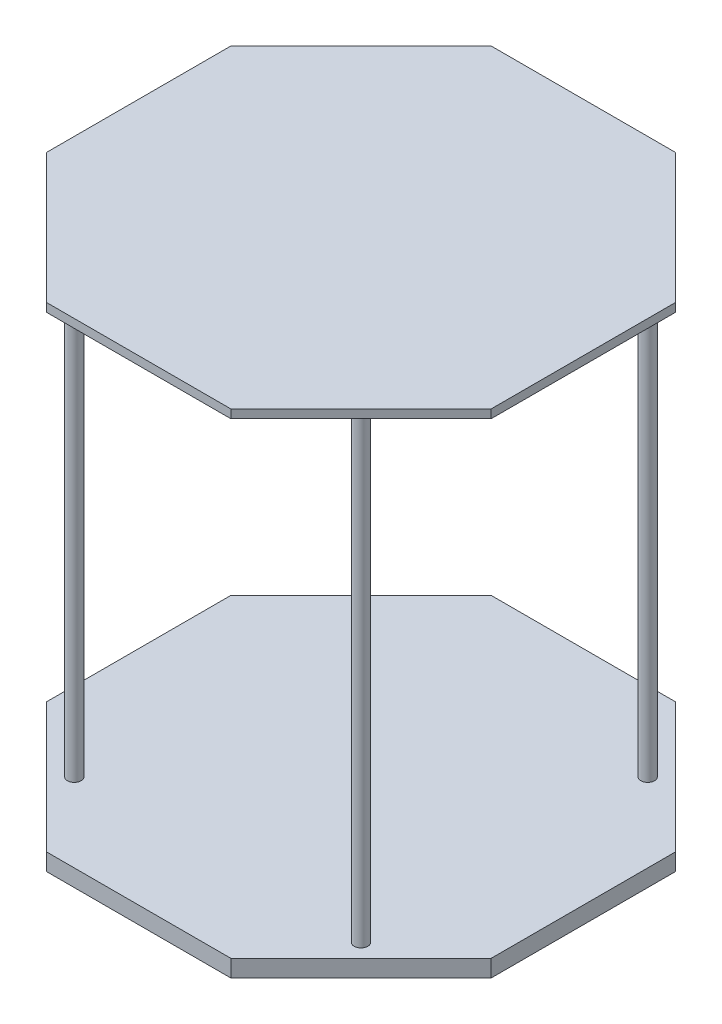
ISO-10303-21;
HEADER;
FILE_DESCRIPTION(('STEP AP214'),'2;1');
FILE_NAME('part.step','',(''),(''),'','','');
FILE_SCHEMA(('AUTOMOTIVE_DESIGN { 1 0 10303 214 1 1 1 1 }'));
ENDSEC;
DATA;
#1=APPLICATION_CONTEXT('core data for automotive mechanical design processes');
#2=APPLICATION_PROTOCOL_DEFINITION('international standard','automotive_design',2000,#1);
#3=PRODUCT_CONTEXT('',#1,'mechanical');
#4=PRODUCT('Part','Part','',(#3));
#5=PRODUCT_RELATED_PRODUCT_CATEGORY('part','',(#4));
#6=PRODUCT_DEFINITION_FORMATION('','',#4);
#7=PRODUCT_DEFINITION_CONTEXT('part definition',#1,'design');
#8=PRODUCT_DEFINITION('design','',#6,#7);
#9=PRODUCT_DEFINITION_SHAPE('','',#8);
#10=(LENGTH_UNIT() NAMED_UNIT(*) SI_UNIT(.MILLI.,.METRE.));
#11=(NAMED_UNIT(*) PLANE_ANGLE_UNIT() SI_UNIT($,.RADIAN.));
#12=(NAMED_UNIT(*) SI_UNIT($,.STERADIAN.) SOLID_ANGLE_UNIT());
#13=UNCERTAINTY_MEASURE_WITH_UNIT(LENGTH_MEASURE(1.E-05),#10,'distance_accuracy_value','');
#14=(GEOMETRIC_REPRESENTATION_CONTEXT(3) GLOBAL_UNCERTAINTY_ASSIGNED_CONTEXT((#13)) GLOBAL_UNIT_ASSIGNED_CONTEXT((#10,
#11,#12)) REPRESENTATION_CONTEXT('',''));
#15=CARTESIAN_POINT('',(0.,0.,0.));
#16=DIRECTION('',(0.,0.,1.));
#17=DIRECTION('',(1.,0.,0.));
#18=AXIS2_PLACEMENT_3D('',#15,#16,#17);
#19=CARTESIAN_POINT('',(82.6843541332094,6.35,34.2489808780352));
#20=DIRECTION('',(-1.,0.,0.));
#21=DIRECTION('',(0.,0.,1.));
#22=AXIS2_PLACEMENT_3D('',#19,#20,#21);
#23=PLANE('',#22);
#24=DIRECTION('',(0.,0.,-1.));
#25=VECTOR('',#24,1.);
#26=CARTESIAN_POINT('',(82.6843541332094,0.,34.2489808780352));
#27=LINE('',#26,#25);
#28=CARTESIAN_POINT('',(82.6843541332094,0.,34.2489808780352));
#29=VERTEX_POINT('',#28);
#30=CARTESIAN_POINT('',(82.6843541332094,0.,-34.2489808780352));
#31=VERTEX_POINT('',#30);
#32=EDGE_CURVE('E138',#29,#31,#27,.T.);
#33=ORIENTED_EDGE('',*,*,#32,.T.);
#34=DIRECTION('',(0.,-1.,0.));
#35=VECTOR('',#34,1.);
#36=CARTESIAN_POINT('',(82.6843541332094,6.35,-34.2489808780352));
#37=LINE('',#36,#35);
#38=CARTESIAN_POINT('',(82.6843541332094,6.35,-34.2489808780352));
#39=VERTEX_POINT('',#38);
#40=EDGE_CURVE('E11',#39,#31,#37,.T.);
#41=ORIENTED_EDGE('',*,*,#40,.F.);
#42=DIRECTION('',(0.,0.,-1.));
#43=VECTOR('',#42,1.);
#44=CARTESIAN_POINT('',(82.6843541332094,6.35,34.2489808780352));
#45=LINE('',#44,#43);
#46=CARTESIAN_POINT('',(82.6843541332094,6.35,34.2489808780352));
#47=VERTEX_POINT('',#46);
#48=EDGE_CURVE('E153',#47,#39,#45,.T.);
#49=ORIENTED_EDGE('',*,*,#48,.F.);
#50=DIRECTION('',(0.,-1.,0.));
#51=VECTOR('',#50,1.);
#52=CARTESIAN_POINT('',(82.6843541332094,6.35,34.2489808780352));
#53=LINE('',#52,#51);
#54=EDGE_CURVE('E134',#47,#29,#53,.T.);
#55=ORIENTED_EDGE('',*,*,#54,.T.);
#56=EDGE_LOOP('',(#33,#41,#49,#55));
#57=FACE_BOUND('',#56,.T.);
#58=ADVANCED_FACE('F38',(#57),#23,.F.);
#59=CARTESIAN_POINT('',(82.6843541332094,6.35,-34.2489808780352));
#60=DIRECTION('',(-0.707106781186547,0.,0.707106781186548));
#61=DIRECTION('',(0.707106781186548,0.,0.707106781186547));
#62=AXIS2_PLACEMENT_3D('',#59,#60,#61);
#63=PLANE('',#62);
#64=DIRECTION('',(-0.707106781186548,0.,-0.707106781186547));
#65=VECTOR('',#64,1.);
#66=CARTESIAN_POINT('',(82.6843541332094,0.,-34.2489808780352));
#67=LINE('',#66,#65);
#68=CARTESIAN_POINT('',(34.2489808780352,0.,-82.6843541332094));
#69=VERTEX_POINT('',#68);
#70=EDGE_CURVE('E141',#31,#69,#67,.T.);
#71=ORIENTED_EDGE('',*,*,#70,.T.);
#72=DIRECTION('',(0.,-1.,0.));
#73=VECTOR('',#72,1.);
#74=CARTESIAN_POINT('',(34.2489808780352,6.35,-82.6843541332094));
#75=LINE('',#74,#73);
#76=CARTESIAN_POINT('',(34.2489808780352,6.35,-82.6843541332094));
#77=VERTEX_POINT('',#76);
#78=EDGE_CURVE('E46',#77,#69,#75,.T.);
#79=ORIENTED_EDGE('',*,*,#78,.F.);
#80=DIRECTION('',(-0.707106781186548,0.,-0.707106781186547));
#81=VECTOR('',#80,1.);
#82=CARTESIAN_POINT('',(82.6843541332094,6.35,-34.2489808780352));
#83=LINE('',#82,#81);
#84=EDGE_CURVE('E98',#39,#77,#83,.T.);
#85=ORIENTED_EDGE('',*,*,#84,.F.);
#86=ORIENTED_EDGE('',*,*,#40,.T.);
#87=EDGE_LOOP('',(#71,#79,#85,#86));
#88=FACE_BOUND('',#87,.T.);
#89=ADVANCED_FACE('F331',(#88),#63,.F.);
#90=CARTESIAN_POINT('',(34.2489808780352,6.35,-82.6843541332094));
#91=DIRECTION('',(0.,0.,1.));
#92=DIRECTION('',(1.,0.,0.));
#93=AXIS2_PLACEMENT_3D('',#90,#91,#92);
#94=PLANE('',#93);
#95=DIRECTION('',(-1.,0.,0.));
#96=VECTOR('',#95,1.);
#97=CARTESIAN_POINT('',(34.2489808780352,0.,-82.6843541332094));
#98=LINE('',#97,#96);
#99=CARTESIAN_POINT('',(-34.2489808780352,0.,-82.6843541332094));
#100=VERTEX_POINT('',#99);
#101=EDGE_CURVE('E144',#69,#100,#98,.T.);
#102=ORIENTED_EDGE('',*,*,#101,.T.);
#103=DIRECTION('',(0.,-1.,0.));
#104=VECTOR('',#103,1.);
#105=CARTESIAN_POINT('',(-34.2489808780352,6.35,-82.6843541332094));
#106=LINE('',#105,#104);
#107=CARTESIAN_POINT('',(-34.2489808780352,6.35,-82.6843541332094));
#108=VERTEX_POINT('',#107);
#109=EDGE_CURVE('E160',#108,#100,#106,.T.);
#110=ORIENTED_EDGE('',*,*,#109,.F.);
#111=DIRECTION('',(-1.,0.,0.));
#112=VECTOR('',#111,1.);
#113=CARTESIAN_POINT('',(34.2489808780352,6.35,-82.6843541332094));
#114=LINE('',#113,#112);
#115=EDGE_CURVE('E168',#77,#108,#114,.T.);
#116=ORIENTED_EDGE('',*,*,#115,.F.);
#117=ORIENTED_EDGE('',*,*,#78,.T.);
#118=EDGE_LOOP('',(#102,#110,#116,#117));
#119=FACE_BOUND('',#118,.T.);
#120=ADVANCED_FACE('F166',(#119),#94,.F.);
#121=CARTESIAN_POINT('',(-34.2489808780352,6.35,-82.6843541332094));
#122=DIRECTION('',(0.707106781186548,0.,0.707106781186547));
#123=DIRECTION('',(0.707106781186547,0.,-0.707106781186548));
#124=AXIS2_PLACEMENT_3D('',#121,#122,#123);
#125=PLANE('',#124);
#126=DIRECTION('',(-0.707106781186547,0.,0.707106781186548));
#127=VECTOR('',#126,1.);
#128=CARTESIAN_POINT('',(-34.2489808780352,0.,-82.6843541332094));
#129=LINE('',#128,#127);
#130=CARTESIAN_POINT('',(-82.6843541332094,0.,-34.2489808780351));
#131=VERTEX_POINT('',#130);
#132=EDGE_CURVE('E146',#100,#131,#129,.T.);
#133=ORIENTED_EDGE('',*,*,#132,.T.);
#134=DIRECTION('',(0.,-1.,0.));
#135=VECTOR('',#134,1.);
#136=CARTESIAN_POINT('',(-82.6843541332094,6.35,-34.2489808780351));
#137=LINE('',#136,#135);
#138=CARTESIAN_POINT('',(-82.6843541332094,6.35,-34.2489808780351));
#139=VERTEX_POINT('',#138);
#140=EDGE_CURVE('E157',#139,#131,#137,.T.);
#141=ORIENTED_EDGE('',*,*,#140,.F.);
#142=DIRECTION('',(-0.707106781186547,0.,0.707106781186548));
#143=VECTOR('',#142,1.);
#144=CARTESIAN_POINT('',(-34.2489808780352,6.35,-82.6843541332094));
#145=LINE('',#144,#143);
#146=EDGE_CURVE('E180',#108,#139,#145,.T.);
#147=ORIENTED_EDGE('',*,*,#146,.F.);
#148=ORIENTED_EDGE('',*,*,#109,.T.);
#149=EDGE_LOOP('',(#133,#141,#147,#148));
#150=FACE_BOUND('',#149,.T.);
#151=ADVANCED_FACE('F176',(#150),#125,.F.);
#152=CARTESIAN_POINT('',(-82.6843541332094,6.35,-34.2489808780351));
#153=DIRECTION('',(1.,0.,0.));
#154=DIRECTION('',(0.,0.,-1.));
#155=AXIS2_PLACEMENT_3D('',#152,#153,#154);
#156=PLANE('',#155);
#157=DIRECTION('',(0.,0.,1.));
#158=VECTOR('',#157,1.);
#159=CARTESIAN_POINT('',(-82.6843541332094,0.,-34.2489808780351));
#160=LINE('',#159,#158);
#161=CARTESIAN_POINT('',(-82.6843541332094,0.,34.2489808780352));
#162=VERTEX_POINT('',#161);
#163=EDGE_CURVE('E148',#131,#162,#160,.T.);
#164=ORIENTED_EDGE('',*,*,#163,.T.);
#165=DIRECTION('',(0.,-1.,0.));
#166=VECTOR('',#165,1.);
#167=CARTESIAN_POINT('',(-82.6843541332094,6.35,34.2489808780352));
#168=LINE('',#167,#166);
#169=CARTESIAN_POINT('',(-82.6843541332094,6.35,34.2489808780352));
#170=VERTEX_POINT('',#169);
#171=EDGE_CURVE('E129',#170,#162,#168,.T.);
#172=ORIENTED_EDGE('',*,*,#171,.F.);
#173=DIRECTION('',(0.,0.,1.));
#174=VECTOR('',#173,1.);
#175=CARTESIAN_POINT('',(-82.6843541332094,6.35,-34.2489808780351));
#176=LINE('',#175,#174);
#177=EDGE_CURVE('E120',#139,#170,#176,.T.);
#178=ORIENTED_EDGE('',*,*,#177,.F.);
#179=ORIENTED_EDGE('',*,*,#140,.T.);
#180=EDGE_LOOP('',(#164,#172,#178,#179));
#181=FACE_BOUND('',#180,.T.);
#182=ADVANCED_FACE('F179',(#181),#156,.F.);
#183=CARTESIAN_POINT('',(-82.6843541332094,6.35,34.2489808780352));
#184=DIRECTION('',(0.707106781186548,0.,-0.707106781186547));
#185=DIRECTION('',(-0.707106781186547,0.,-0.707106781186548));
#186=AXIS2_PLACEMENT_3D('',#183,#184,#185);
#187=PLANE('',#186);
#188=DIRECTION('',(0.707106781186547,0.,0.707106781186548));
#189=VECTOR('',#188,1.);
#190=CARTESIAN_POINT('',(-82.6843541332094,0.,34.2489808780352));
#191=LINE('',#190,#189);
#192=CARTESIAN_POINT('',(-34.2489808780352,0.,82.6843541332094));
#193=VERTEX_POINT('',#192);
#194=EDGE_CURVE('E128',#162,#193,#191,.T.);
#195=ORIENTED_EDGE('',*,*,#194,.T.);
#196=DIRECTION('',(0.,-1.,0.));
#197=VECTOR('',#196,1.);
#198=CARTESIAN_POINT('',(-34.2489808780352,6.35,82.6843541332094));
#199=LINE('',#198,#197);
#200=CARTESIAN_POINT('',(-34.2489808780352,6.35,82.6843541332094));
#201=VERTEX_POINT('',#200);
#202=EDGE_CURVE('E125',#201,#193,#199,.T.);
#203=ORIENTED_EDGE('',*,*,#202,.F.);
#204=DIRECTION('',(0.707106781186547,0.,0.707106781186548));
#205=VECTOR('',#204,1.);
#206=CARTESIAN_POINT('',(-82.6843541332094,6.35,34.2489808780352));
#207=LINE('',#206,#205);
#208=EDGE_CURVE('E114',#170,#201,#207,.T.);
#209=ORIENTED_EDGE('',*,*,#208,.F.);
#210=ORIENTED_EDGE('',*,*,#171,.T.);
#211=EDGE_LOOP('',(#195,#203,#209,#210));
#212=FACE_BOUND('',#211,.T.);
#213=ADVANCED_FACE('F126',(#212),#187,.F.);
#214=CARTESIAN_POINT('',(-34.2489808780352,6.35,82.6843541332094));
#215=DIRECTION('',(0.,0.,-1.));
#216=DIRECTION('',(-1.,0.,0.));
#217=AXIS2_PLACEMENT_3D('',#214,#215,#216);
#218=PLANE('',#217);
#219=DIRECTION('',(1.,0.,0.));
#220=VECTOR('',#219,1.);
#221=CARTESIAN_POINT('',(-34.2489808780352,0.,82.6843541332094));
#222=LINE('',#221,#220);
#223=CARTESIAN_POINT('',(34.2489808780352,0.,82.6843541332094));
#224=VERTEX_POINT('',#223);
#225=EDGE_CURVE('E84',#193,#224,#222,.T.);
#226=ORIENTED_EDGE('',*,*,#225,.T.);
#227=DIRECTION('',(0.,-1.,0.));
#228=VECTOR('',#227,1.);
#229=CARTESIAN_POINT('',(34.2489808780352,6.35,82.6843541332094));
#230=LINE('',#229,#228);
#231=CARTESIAN_POINT('',(34.2489808780352,6.35,82.6843541332094));
#232=VERTEX_POINT('',#231);
#233=EDGE_CURVE('E130',#232,#224,#230,.T.);
#234=ORIENTED_EDGE('',*,*,#233,.F.);
#235=DIRECTION('',(1.,0.,0.));
#236=VECTOR('',#235,1.);
#237=CARTESIAN_POINT('',(-34.2489808780352,6.35,82.6843541332094));
#238=LINE('',#237,#236);
#239=EDGE_CURVE('E118',#201,#232,#238,.T.);
#240=ORIENTED_EDGE('',*,*,#239,.F.);
#241=ORIENTED_EDGE('',*,*,#202,.T.);
#242=EDGE_LOOP('',(#226,#234,#240,#241));
#243=FACE_BOUND('',#242,.T.);
#244=ADVANCED_FACE('F132',(#243),#218,.F.);
#245=CARTESIAN_POINT('',(34.2489808780352,6.35,82.6843541332094));
#246=DIRECTION('',(-0.707106781186547,0.,-0.707106781186548));
#247=DIRECTION('',(-0.707106781186548,0.,0.707106781186547));
#248=AXIS2_PLACEMENT_3D('',#245,#246,#247);
#249=PLANE('',#248);
#250=DIRECTION('',(0.707106781186548,0.,-0.707106781186547));
#251=VECTOR('',#250,1.);
#252=CARTESIAN_POINT('',(34.2489808780352,0.,82.6843541332094));
#253=LINE('',#252,#251);
#254=EDGE_CURVE('E90',#224,#29,#253,.T.);
#255=ORIENTED_EDGE('',*,*,#254,.T.);
#256=ORIENTED_EDGE('',*,*,#54,.F.);
#257=DIRECTION('',(0.707106781186548,0.,-0.707106781186547));
#258=VECTOR('',#257,1.);
#259=CARTESIAN_POINT('',(34.2489808780352,6.35,82.6843541332094));
#260=LINE('',#259,#258);
#261=EDGE_CURVE('E54',#232,#47,#260,.T.);
#262=ORIENTED_EDGE('',*,*,#261,.F.);
#263=ORIENTED_EDGE('',*,*,#233,.T.);
#264=EDGE_LOOP('',(#255,#256,#262,#263));
#265=FACE_BOUND('',#264,.T.);
#266=ADVANCED_FACE('F338',(#265),#249,.F.);
#267=CARTESIAN_POINT('',(0.,6.35,0.));
#268=DIRECTION('',(0.,1.,0.));
#269=DIRECTION('',(0.,0.,1.));
#270=AXIS2_PLACEMENT_3D('',#267,#268,#269);
#271=PLANE('',#270);
#272=CARTESIAN_POINT('',(-53.34,6.35,53.34));
#273=DIRECTION('',(0.,1.,0.));
#274=DIRECTION('',(0.,0.,1.));
#275=AXIS2_PLACEMENT_3D('',#272,#273,#274);
#276=CIRCLE('',#275,2.54);
#277=CARTESIAN_POINT('',(-53.34,6.35,55.88));
#278=VERTEX_POINT('',#277);
#279=EDGE_CURVE('E204',#278,#278,#276,.T.);
#280=ORIENTED_EDGE('',*,*,#279,.F.);
#281=EDGE_LOOP('',(#280));
#282=FACE_BOUND('',#281,.T.);
#283=CARTESIAN_POINT('',(53.34,6.35,53.34));
#284=DIRECTION('',(0.,1.,0.));
#285=DIRECTION('',(0.,0.,-1.));
#286=AXIS2_PLACEMENT_3D('',#283,#284,#285);
#287=CIRCLE('',#286,2.54);
#288=CARTESIAN_POINT('',(53.34,6.35,50.8));
#289=VERTEX_POINT('',#288);
#290=EDGE_CURVE('E198',#289,#289,#287,.T.);
#291=ORIENTED_EDGE('',*,*,#290,.F.);
#292=EDGE_LOOP('',(#291));
#293=FACE_BOUND('',#292,.T.);
#294=CARTESIAN_POINT('',(-53.34,6.35,-53.34));
#295=DIRECTION('',(0.,1.,0.));
#296=DIRECTION('',(0.,0.,-1.));
#297=AXIS2_PLACEMENT_3D('',#294,#295,#296);
#298=CIRCLE('',#297,2.54);
#299=CARTESIAN_POINT('',(-53.34,6.35,-55.88));
#300=VERTEX_POINT('',#299);
#301=EDGE_CURVE('E192',#300,#300,#298,.T.);
#302=ORIENTED_EDGE('',*,*,#301,.F.);
#303=EDGE_LOOP('',(#302));
#304=FACE_BOUND('',#303,.T.);
#305=CARTESIAN_POINT('',(53.34,6.35,-53.34));
#306=DIRECTION('',(0.,1.,0.));
#307=DIRECTION('',(0.,0.,1.));
#308=AXIS2_PLACEMENT_3D('',#305,#306,#307);
#309=CIRCLE('',#308,2.54);
#310=CARTESIAN_POINT('',(53.34,6.35,-50.8));
#311=VERTEX_POINT('',#310);
#312=EDGE_CURVE('E186',#311,#311,#309,.T.);
#313=ORIENTED_EDGE('',*,*,#312,.F.);
#314=EDGE_LOOP('',(#313));
#315=FACE_BOUND('',#314,.T.);
#316=ORIENTED_EDGE('',*,*,#48,.T.);
#317=ORIENTED_EDGE('',*,*,#84,.T.);
#318=ORIENTED_EDGE('',*,*,#115,.T.);
#319=ORIENTED_EDGE('',*,*,#146,.T.);
#320=ORIENTED_EDGE('',*,*,#177,.T.);
#321=ORIENTED_EDGE('',*,*,#208,.T.);
#322=ORIENTED_EDGE('',*,*,#239,.T.);
#323=ORIENTED_EDGE('',*,*,#261,.T.);
#324=EDGE_LOOP('',(#316,#317,#318,#319,#320,#321,#322,#323));
#325=FACE_BOUND('',#324,.T.);
#326=ADVANCED_FACE('F116',(#282,#293,#304,#315,#325),#271,.T.);
#327=CARTESIAN_POINT('',(0.,0.,0.));
#328=DIRECTION('',(0.,1.,0.));
#329=DIRECTION('',(0.,0.,1.));
#330=AXIS2_PLACEMENT_3D('',#327,#328,#329);
#331=PLANE('',#330);
#332=ORIENTED_EDGE('',*,*,#32,.F.);
#333=ORIENTED_EDGE('',*,*,#254,.F.);
#334=ORIENTED_EDGE('',*,*,#225,.F.);
#335=ORIENTED_EDGE('',*,*,#194,.F.);
#336=ORIENTED_EDGE('',*,*,#163,.F.);
#337=ORIENTED_EDGE('',*,*,#132,.F.);
#338=ORIENTED_EDGE('',*,*,#101,.F.);
#339=ORIENTED_EDGE('',*,*,#70,.F.);
#340=EDGE_LOOP('',(#332,#333,#334,#335,#336,#337,#338,#339));
#341=FACE_BOUND('',#340,.T.);
#342=ADVANCED_FACE('F172',(#341),#331,.F.);
#343=CARTESIAN_POINT('',(53.34,180.213,-53.34));
#344=DIRECTION('',(0.,-1.,0.));
#345=DIRECTION('',(0.,0.,-1.));
#346=AXIS2_PLACEMENT_3D('',#343,#344,#345);
#347=CYLINDRICAL_SURFACE('',#346,2.54);
#348=CARTESIAN_POINT('',(53.34,180.213,-53.34));
#349=DIRECTION('',(0.,1.,0.));
#350=DIRECTION('',(0.,0.,1.));
#351=AXIS2_PLACEMENT_3D('',#348,#349,#350);
#352=CIRCLE('',#351,2.54);
#353=CARTESIAN_POINT('',(53.34,180.213,-50.8));
#354=VERTEX_POINT('',#353);
#355=EDGE_CURVE('E142',#354,#354,#352,.T.);
#356=ORIENTED_EDGE('',*,*,#355,.F.);
#357=EDGE_LOOP('',(#356));
#358=FACE_BOUND('',#357,.T.);
#359=ORIENTED_EDGE('',*,*,#312,.T.);
#360=EDGE_LOOP('',(#359));
#361=FACE_BOUND('',#360,.T.);
#362=ADVANCED_FACE('F391',(#358,#361),#347,.T.);
#363=CARTESIAN_POINT('',(-53.34,180.213,-53.34));
#364=DIRECTION('',(0.,-1.,0.));
#365=DIRECTION('',(0.,0.,-1.));
#366=AXIS2_PLACEMENT_3D('',#363,#364,#365);
#367=CYLINDRICAL_SURFACE('',#366,2.54);
#368=CARTESIAN_POINT('',(-53.34,180.213,-53.34));
#369=DIRECTION('',(0.,1.,0.));
#370=DIRECTION('',(0.,0.,-1.));
#371=AXIS2_PLACEMENT_3D('',#368,#369,#370);
#372=CIRCLE('',#371,2.54);
#373=CARTESIAN_POINT('',(-53.34,180.213,-55.88));
#374=VERTEX_POINT('',#373);
#375=EDGE_CURVE('E189',#374,#374,#372,.T.);
#376=ORIENTED_EDGE('',*,*,#375,.F.);
#377=EDGE_LOOP('',(#376));
#378=FACE_BOUND('',#377,.T.);
#379=ORIENTED_EDGE('',*,*,#301,.T.);
#380=EDGE_LOOP('',(#379));
#381=FACE_BOUND('',#380,.T.);
#382=ADVANCED_FACE('F404',(#378,#381),#367,.T.);
#383=CARTESIAN_POINT('',(53.34,180.213,53.34));
#384=DIRECTION('',(0.,-1.,0.));
#385=DIRECTION('',(0.,0.,-1.));
#386=AXIS2_PLACEMENT_3D('',#383,#384,#385);
#387=CYLINDRICAL_SURFACE('',#386,2.54);
#388=CARTESIAN_POINT('',(53.34,180.213,53.34));
#389=DIRECTION('',(0.,1.,0.));
#390=DIRECTION('',(0.,0.,-1.));
#391=AXIS2_PLACEMENT_3D('',#388,#389,#390);
#392=CIRCLE('',#391,2.54);
#393=CARTESIAN_POINT('',(53.34,180.213,50.8));
#394=VERTEX_POINT('',#393);
#395=EDGE_CURVE('E195',#394,#394,#392,.T.);
#396=ORIENTED_EDGE('',*,*,#395,.F.);
#397=EDGE_LOOP('',(#396));
#398=FACE_BOUND('',#397,.T.);
#399=ORIENTED_EDGE('',*,*,#290,.T.);
#400=EDGE_LOOP('',(#399));
#401=FACE_BOUND('',#400,.T.);
#402=ADVANCED_FACE('F414',(#398,#401),#387,.T.);
#403=CARTESIAN_POINT('',(-53.34,180.213,53.34));
#404=DIRECTION('',(0.,-1.,0.));
#405=DIRECTION('',(0.,0.,-1.));
#406=AXIS2_PLACEMENT_3D('',#403,#404,#405);
#407=CYLINDRICAL_SURFACE('',#406,2.54);
#408=CARTESIAN_POINT('',(-53.34,180.213,53.34));
#409=DIRECTION('',(0.,1.,0.));
#410=DIRECTION('',(0.,0.,1.));
#411=AXIS2_PLACEMENT_3D('',#408,#409,#410);
#412=CIRCLE('',#411,2.54);
#413=CARTESIAN_POINT('',(-53.34,180.213,55.88));
#414=VERTEX_POINT('',#413);
#415=EDGE_CURVE('E201',#414,#414,#412,.T.);
#416=ORIENTED_EDGE('',*,*,#415,.F.);
#417=EDGE_LOOP('',(#416));
#418=FACE_BOUND('',#417,.T.);
#419=ORIENTED_EDGE('',*,*,#279,.T.);
#420=EDGE_LOOP('',(#419));
#421=FACE_BOUND('',#420,.T.);
#422=ADVANCED_FACE('F424',(#418,#421),#407,.T.);
#423=CARTESIAN_POINT('',(34.2489808780352,183.388,82.6843541332094));
#424=DIRECTION('',(-0.707106781186547,0.,-0.707106781186548));
#425=DIRECTION('',(-0.707106781186548,0.,0.707106781186547));
#426=AXIS2_PLACEMENT_3D('',#423,#424,#425);
#427=PLANE('',#426);
#428=DIRECTION('',(0.707106781186548,0.,-0.707106781186547));
#429=VECTOR('',#428,1.);
#430=CARTESIAN_POINT('',(34.2489808780352,180.213,82.6843541332094));
#431=LINE('',#430,#429);
#432=CARTESIAN_POINT('',(34.2489808780352,180.213,82.6843541332094));
#433=VERTEX_POINT('',#432);
#434=CARTESIAN_POINT('',(82.6843541332094,180.213,34.2489808780352));
#435=VERTEX_POINT('',#434);
#436=EDGE_CURVE('E256',#433,#435,#431,.T.);
#437=ORIENTED_EDGE('',*,*,#436,.T.);
#438=DIRECTION('',(0.,-1.,0.));
#439=VECTOR('',#438,1.);
#440=CARTESIAN_POINT('',(82.6843541332094,183.388,34.2489808780352));
#441=LINE('',#440,#439);
#442=CARTESIAN_POINT('',(82.6843541332094,183.388,34.2489808780352));
#443=VERTEX_POINT('',#442);
#444=EDGE_CURVE('E207',#443,#435,#441,.T.);
#445=ORIENTED_EDGE('',*,*,#444,.F.);
#446=DIRECTION('',(0.707106781186548,0.,-0.707106781186547));
#447=VECTOR('',#446,1.);
#448=CARTESIAN_POINT('',(34.2489808780352,183.388,82.6843541332094));
#449=LINE('',#448,#447);
#450=CARTESIAN_POINT('',(34.2489808780352,183.388,82.6843541332094));
#451=VERTEX_POINT('',#450);
#452=EDGE_CURVE('E237',#451,#443,#449,.T.);
#453=ORIENTED_EDGE('',*,*,#452,.F.);
#454=DIRECTION('',(0.,-1.,0.));
#455=VECTOR('',#454,1.);
#456=CARTESIAN_POINT('',(34.2489808780352,183.388,82.6843541332094));
#457=LINE('',#456,#455);
#458=EDGE_CURVE('E230',#451,#433,#457,.T.);
#459=ORIENTED_EDGE('',*,*,#458,.T.);
#460=EDGE_LOOP('',(#437,#445,#453,#459));
#461=FACE_BOUND('',#460,.T.);
#462=ADVANCED_FACE('F292',(#461),#427,.F.);
#463=CARTESIAN_POINT('',(82.6843541332094,183.388,34.2489808780352));
#464=DIRECTION('',(-1.,0.,0.));
#465=DIRECTION('',(0.,0.,1.));
#466=AXIS2_PLACEMENT_3D('',#463,#464,#465);
#467=PLANE('',#466);
#468=DIRECTION('',(0.,0.,-1.));
#469=VECTOR('',#468,1.);
#470=CARTESIAN_POINT('',(82.6843541332094,180.213,34.2489808780352));
#471=LINE('',#470,#469);
#472=CARTESIAN_POINT('',(82.6843541332094,180.213,-34.2489808780352));
#473=VERTEX_POINT('',#472);
#474=EDGE_CURVE('E253',#435,#473,#471,.T.);
#475=ORIENTED_EDGE('',*,*,#474,.T.);
#476=DIRECTION('',(0.,-1.,0.));
#477=VECTOR('',#476,1.);
#478=CARTESIAN_POINT('',(82.6843541332094,183.388,-34.2489808780352));
#479=LINE('',#478,#477);
#480=CARTESIAN_POINT('',(82.6843541332094,183.388,-34.2489808780352));
#481=VERTEX_POINT('',#480);
#482=EDGE_CURVE('E212',#481,#473,#479,.T.);
#483=ORIENTED_EDGE('',*,*,#482,.F.);
#484=DIRECTION('',(0.,0.,-1.));
#485=VECTOR('',#484,1.);
#486=CARTESIAN_POINT('',(82.6843541332094,183.388,34.2489808780352));
#487=LINE('',#486,#485);
#488=EDGE_CURVE('E276',#443,#481,#487,.T.);
#489=ORIENTED_EDGE('',*,*,#488,.F.);
#490=ORIENTED_EDGE('',*,*,#444,.T.);
#491=EDGE_LOOP('',(#475,#483,#489,#490));
#492=FACE_BOUND('',#491,.T.);
#493=ADVANCED_FACE('F296',(#492),#467,.F.);
#494=CARTESIAN_POINT('',(82.6843541332094,183.388,-34.2489808780352));
#495=DIRECTION('',(-0.707106781186547,0.,0.707106781186548));
#496=DIRECTION('',(0.707106781186548,0.,0.707106781186547));
#497=AXIS2_PLACEMENT_3D('',#494,#495,#496);
#498=PLANE('',#497);
#499=DIRECTION('',(-0.707106781186548,0.,-0.707106781186547));
#500=VECTOR('',#499,1.);
#501=CARTESIAN_POINT('',(82.6843541332094,180.213,-34.2489808780352));
#502=LINE('',#501,#500);
#503=CARTESIAN_POINT('',(34.2489808780352,180.213,-82.6843541332094));
#504=VERTEX_POINT('',#503);
#505=EDGE_CURVE('E250',#473,#504,#502,.T.);
#506=ORIENTED_EDGE('',*,*,#505,.T.);
#507=DIRECTION('',(0.,-1.,0.));
#508=VECTOR('',#507,1.);
#509=CARTESIAN_POINT('',(34.2489808780352,183.388,-82.6843541332094));
#510=LINE('',#509,#508);
#511=CARTESIAN_POINT('',(34.2489808780352,183.388,-82.6843541332094));
#512=VERTEX_POINT('',#511);
#513=EDGE_CURVE('E215',#512,#504,#510,.T.);
#514=ORIENTED_EDGE('',*,*,#513,.F.);
#515=DIRECTION('',(-0.707106781186548,0.,-0.707106781186547));
#516=VECTOR('',#515,1.);
#517=CARTESIAN_POINT('',(82.6843541332094,183.388,-34.2489808780352));
#518=LINE('',#517,#516);
#519=EDGE_CURVE('E273',#481,#512,#518,.T.);
#520=ORIENTED_EDGE('',*,*,#519,.F.);
#521=ORIENTED_EDGE('',*,*,#482,.T.);
#522=EDGE_LOOP('',(#506,#514,#520,#521));
#523=FACE_BOUND('',#522,.T.);
#524=ADVANCED_FACE('F451',(#523),#498,.F.);
#525=CARTESIAN_POINT('',(34.2489808780352,183.388,-82.6843541332094));
#526=DIRECTION('',(0.,0.,1.));
#527=DIRECTION('',(1.,0.,0.));
#528=AXIS2_PLACEMENT_3D('',#525,#526,#527);
#529=PLANE('',#528);
#530=DIRECTION('',(-1.,0.,0.));
#531=VECTOR('',#530,1.);
#532=CARTESIAN_POINT('',(34.2489808780352,180.213,-82.6843541332094));
#533=LINE('',#532,#531);
#534=CARTESIAN_POINT('',(-34.2489808780352,180.213,-82.6843541332094));
#535=VERTEX_POINT('',#534);
#536=EDGE_CURVE('E247',#504,#535,#533,.T.);
#537=ORIENTED_EDGE('',*,*,#536,.T.);
#538=DIRECTION('',(0.,-1.,0.));
#539=VECTOR('',#538,1.);
#540=CARTESIAN_POINT('',(-34.2489808780352,183.388,-82.6843541332094));
#541=LINE('',#540,#539);
#542=CARTESIAN_POINT('',(-34.2489808780352,183.388,-82.6843541332094));
#543=VERTEX_POINT('',#542);
#544=EDGE_CURVE('E218',#543,#535,#541,.T.);
#545=ORIENTED_EDGE('',*,*,#544,.F.);
#546=DIRECTION('',(-1.,0.,0.));
#547=VECTOR('',#546,1.);
#548=CARTESIAN_POINT('',(34.2489808780352,183.388,-82.6843541332094));
#549=LINE('',#548,#547);
#550=EDGE_CURVE('E270',#512,#543,#549,.T.);
#551=ORIENTED_EDGE('',*,*,#550,.F.);
#552=ORIENTED_EDGE('',*,*,#513,.T.);
#553=EDGE_LOOP('',(#537,#545,#551,#552));
#554=FACE_BOUND('',#553,.T.);
#555=ADVANCED_FACE('F460',(#554),#529,.F.);
#556=CARTESIAN_POINT('',(-34.2489808780352,183.388,-82.6843541332094));
#557=DIRECTION('',(0.707106781186548,0.,0.707106781186547));
#558=DIRECTION('',(0.707106781186547,0.,-0.707106781186548));
#559=AXIS2_PLACEMENT_3D('',#556,#557,#558);
#560=PLANE('',#559);
#561=DIRECTION('',(-0.707106781186547,0.,0.707106781186548));
#562=VECTOR('',#561,1.);
#563=CARTESIAN_POINT('',(-34.2489808780352,180.213,-82.6843541332094));
#564=LINE('',#563,#562);
#565=CARTESIAN_POINT('',(-82.6843541332094,180.213,-34.2489808780351));
#566=VERTEX_POINT('',#565);
#567=EDGE_CURVE('E244',#535,#566,#564,.T.);
#568=ORIENTED_EDGE('',*,*,#567,.T.);
#569=DIRECTION('',(0.,-1.,0.));
#570=VECTOR('',#569,1.);
#571=CARTESIAN_POINT('',(-82.6843541332094,183.388,-34.2489808780351));
#572=LINE('',#571,#570);
#573=CARTESIAN_POINT('',(-82.6843541332094,183.388,-34.2489808780351));
#574=VERTEX_POINT('',#573);
#575=EDGE_CURVE('E221',#574,#566,#572,.T.);
#576=ORIENTED_EDGE('',*,*,#575,.F.);
#577=DIRECTION('',(-0.707106781186547,0.,0.707106781186548));
#578=VECTOR('',#577,1.);
#579=CARTESIAN_POINT('',(-34.2489808780352,183.388,-82.6843541332094));
#580=LINE('',#579,#578);
#581=EDGE_CURVE('E267',#543,#574,#580,.T.);
#582=ORIENTED_EDGE('',*,*,#581,.F.);
#583=ORIENTED_EDGE('',*,*,#544,.T.);
#584=EDGE_LOOP('',(#568,#576,#582,#583));
#585=FACE_BOUND('',#584,.T.);
#586=ADVANCED_FACE('F470',(#585),#560,.F.);
#587=CARTESIAN_POINT('',(-82.6843541332094,183.388,-34.2489808780351));
#588=DIRECTION('',(1.,0.,0.));
#589=DIRECTION('',(0.,0.,-1.));
#590=AXIS2_PLACEMENT_3D('',#587,#588,#589);
#591=PLANE('',#590);
#592=DIRECTION('',(0.,0.,1.));
#593=VECTOR('',#592,1.);
#594=CARTESIAN_POINT('',(-82.6843541332094,180.213,-34.2489808780351));
#595=LINE('',#594,#593);
#596=CARTESIAN_POINT('',(-82.6843541332094,180.213,34.2489808780352));
#597=VERTEX_POINT('',#596);
#598=EDGE_CURVE('E241',#566,#597,#595,.T.);
#599=ORIENTED_EDGE('',*,*,#598,.T.);
#600=DIRECTION('',(0.,-1.,0.));
#601=VECTOR('',#600,1.);
#602=CARTESIAN_POINT('',(-82.6843541332094,183.388,34.2489808780352));
#603=LINE('',#602,#601);
#604=CARTESIAN_POINT('',(-82.6843541332094,183.388,34.2489808780352));
#605=VERTEX_POINT('',#604);
#606=EDGE_CURVE('E224',#605,#597,#603,.T.);
#607=ORIENTED_EDGE('',*,*,#606,.F.);
#608=DIRECTION('',(0.,0.,1.));
#609=VECTOR('',#608,1.);
#610=CARTESIAN_POINT('',(-82.6843541332094,183.388,-34.2489808780351));
#611=LINE('',#610,#609);
#612=EDGE_CURVE('E264',#574,#605,#611,.T.);
#613=ORIENTED_EDGE('',*,*,#612,.F.);
#614=ORIENTED_EDGE('',*,*,#575,.T.);
#615=EDGE_LOOP('',(#599,#607,#613,#614));
#616=FACE_BOUND('',#615,.T.);
#617=ADVANCED_FACE('F480',(#616),#591,.F.);
#618=CARTESIAN_POINT('',(-82.6843541332094,183.388,34.2489808780352));
#619=DIRECTION('',(0.707106781186548,0.,-0.707106781186547));
#620=DIRECTION('',(-0.707106781186547,0.,-0.707106781186548));
#621=AXIS2_PLACEMENT_3D('',#618,#619,#620);
#622=PLANE('',#621);
#623=DIRECTION('',(0.707106781186547,0.,0.707106781186548));
#624=VECTOR('',#623,1.);
#625=CARTESIAN_POINT('',(-82.6843541332094,180.213,34.2489808780352));
#626=LINE('',#625,#624);
#627=CARTESIAN_POINT('',(-34.2489808780352,180.213,82.6843541332094));
#628=VERTEX_POINT('',#627);
#629=EDGE_CURVE('E238',#597,#628,#626,.T.);
#630=ORIENTED_EDGE('',*,*,#629,.T.);
#631=DIRECTION('',(0.,-1.,0.));
#632=VECTOR('',#631,1.);
#633=CARTESIAN_POINT('',(-34.2489808780352,183.388,82.6843541332094));
#634=LINE('',#633,#632);
#635=CARTESIAN_POINT('',(-34.2489808780352,183.388,82.6843541332094));
#636=VERTEX_POINT('',#635);
#637=EDGE_CURVE('E227',#636,#628,#634,.T.);
#638=ORIENTED_EDGE('',*,*,#637,.F.);
#639=DIRECTION('',(0.707106781186547,0.,0.707106781186548));
#640=VECTOR('',#639,1.);
#641=CARTESIAN_POINT('',(-82.6843541332094,183.388,34.2489808780352));
#642=LINE('',#641,#640);
#643=EDGE_CURVE('E261',#605,#636,#642,.T.);
#644=ORIENTED_EDGE('',*,*,#643,.F.);
#645=ORIENTED_EDGE('',*,*,#606,.T.);
#646=EDGE_LOOP('',(#630,#638,#644,#645));
#647=FACE_BOUND('',#646,.T.);
#648=ADVANCED_FACE('F490',(#647),#622,.F.);
#649=CARTESIAN_POINT('',(-34.2489808780352,183.388,82.6843541332094));
#650=DIRECTION('',(0.,0.,-1.));
#651=DIRECTION('',(-1.,0.,0.));
#652=AXIS2_PLACEMENT_3D('',#649,#650,#651);
#653=PLANE('',#652);
#654=DIRECTION('',(1.,0.,0.));
#655=VECTOR('',#654,1.);
#656=CARTESIAN_POINT('',(-34.2489808780352,180.213,82.6843541332094));
#657=LINE('',#656,#655);
#658=EDGE_CURVE('E234',#628,#433,#657,.T.);
#659=ORIENTED_EDGE('',*,*,#658,.T.);
#660=ORIENTED_EDGE('',*,*,#458,.F.);
#661=DIRECTION('',(1.,0.,0.));
#662=VECTOR('',#661,1.);
#663=CARTESIAN_POINT('',(-34.2489808780352,183.388,82.6843541332094));
#664=LINE('',#663,#662);
#665=EDGE_CURVE('E233',#636,#451,#664,.T.);
#666=ORIENTED_EDGE('',*,*,#665,.F.);
#667=ORIENTED_EDGE('',*,*,#637,.T.);
#668=EDGE_LOOP('',(#659,#660,#666,#667));
#669=FACE_BOUND('',#668,.T.);
#670=ADVANCED_FACE('F319',(#669),#653,.F.);
#671=CARTESIAN_POINT('',(0.,183.388,0.));
#672=DIRECTION('',(0.,1.,0.));
#673=DIRECTION('',(0.,0.,1.));
#674=AXIS2_PLACEMENT_3D('',#671,#672,#673);
#675=PLANE('',#674);
#676=ORIENTED_EDGE('',*,*,#452,.T.);
#677=ORIENTED_EDGE('',*,*,#488,.T.);
#678=ORIENTED_EDGE('',*,*,#519,.T.);
#679=ORIENTED_EDGE('',*,*,#550,.T.);
#680=ORIENTED_EDGE('',*,*,#581,.T.);
#681=ORIENTED_EDGE('',*,*,#612,.T.);
#682=ORIENTED_EDGE('',*,*,#643,.T.);
#683=ORIENTED_EDGE('',*,*,#665,.T.);
#684=EDGE_LOOP('',(#676,#677,#678,#679,#680,#681,#682,#683));
#685=FACE_BOUND('',#684,.T.);
#686=ADVANCED_FACE('F284',(#685),#675,.T.);
#687=CARTESIAN_POINT('',(0.,180.213,0.));
#688=DIRECTION('',(0.,1.,0.));
#689=DIRECTION('',(0.,0.,1.));
#690=AXIS2_PLACEMENT_3D('',#687,#688,#689);
#691=PLANE('',#690);
#692=ORIENTED_EDGE('',*,*,#355,.T.);
#693=EDGE_LOOP('',(#692));
#694=FACE_BOUND('',#693,.T.);
#695=ORIENTED_EDGE('',*,*,#375,.T.);
#696=EDGE_LOOP('',(#695));
#697=FACE_BOUND('',#696,.T.);
#698=ORIENTED_EDGE('',*,*,#395,.T.);
#699=EDGE_LOOP('',(#698));
#700=FACE_BOUND('',#699,.T.);
#701=ORIENTED_EDGE('',*,*,#415,.T.);
#702=EDGE_LOOP('',(#701));
#703=FACE_BOUND('',#702,.T.);
#704=ORIENTED_EDGE('',*,*,#436,.F.);
#705=ORIENTED_EDGE('',*,*,#658,.F.);
#706=ORIENTED_EDGE('',*,*,#629,.F.);
#707=ORIENTED_EDGE('',*,*,#598,.F.);
#708=ORIENTED_EDGE('',*,*,#567,.F.);
#709=ORIENTED_EDGE('',*,*,#536,.F.);
#710=ORIENTED_EDGE('',*,*,#505,.F.);
#711=ORIENTED_EDGE('',*,*,#474,.F.);
#712=EDGE_LOOP('',(#704,#705,#706,#707,#708,#709,#710,#711));
#713=FACE_BOUND('',#712,.T.);
#714=ADVANCED_FACE('F320',(#694,#697,#700,#703,#713),#691,.F.);
#715=CLOSED_SHELL('',(#58,#89,#120,#151,#182,#213,#244,#266,#326,#342,#362,#382,#402,#422,#462,
#493,#524,#555,#586,#617,#648,#670,#686,#714));
#716=MANIFOLD_SOLID_BREP('B2',#715);
#717=ADVANCED_BREP_SHAPE_REPRESENTATION('',(#18,#716),#14);
#718=SHAPE_DEFINITION_REPRESENTATION(#9,#717);
ENDSEC;
END-ISO-10303-21;
